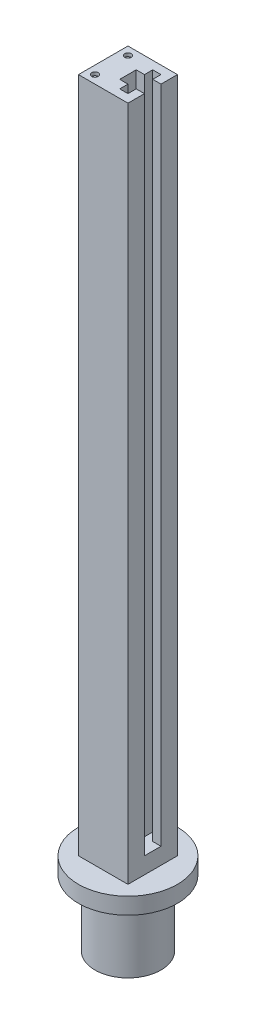
ISO-10303-21;
HEADER;
FILE_DESCRIPTION(('STEP AP214'),'2;1');
FILE_NAME('part.step','',(''),(''),'','','');
FILE_SCHEMA(('AUTOMOTIVE_DESIGN { 1 0 10303 214 1 1 1 1 }'));
ENDSEC;
DATA;
#1=APPLICATION_CONTEXT('core data for automotive mechanical design processes');
#2=APPLICATION_PROTOCOL_DEFINITION('international standard','automotive_design',2000,#1);
#3=PRODUCT_CONTEXT('',#1,'mechanical');
#4=PRODUCT('Part','Part','',(#3));
#5=PRODUCT_RELATED_PRODUCT_CATEGORY('part','',(#4));
#6=PRODUCT_DEFINITION_FORMATION('','',#4);
#7=PRODUCT_DEFINITION_CONTEXT('part definition',#1,'design');
#8=PRODUCT_DEFINITION('design','',#6,#7);
#9=PRODUCT_DEFINITION_SHAPE('','',#8);
#10=(LENGTH_UNIT() NAMED_UNIT(*) SI_UNIT(.MILLI.,.METRE.));
#11=(NAMED_UNIT(*) PLANE_ANGLE_UNIT() SI_UNIT($,.RADIAN.));
#12=(NAMED_UNIT(*) SI_UNIT($,.STERADIAN.) SOLID_ANGLE_UNIT());
#13=UNCERTAINTY_MEASURE_WITH_UNIT(LENGTH_MEASURE(1.E-05),#10,'distance_accuracy_value','');
#14=(GEOMETRIC_REPRESENTATION_CONTEXT(3) GLOBAL_UNCERTAINTY_ASSIGNED_CONTEXT((#13)) GLOBAL_UNIT_ASSIGNED_CONTEXT((#10,
#11,#12)) REPRESENTATION_CONTEXT('',''));
#15=CARTESIAN_POINT('',(0.,0.,0.));
#16=DIRECTION('',(0.,0.,1.));
#17=DIRECTION('',(1.,0.,0.));
#18=AXIS2_PLACEMENT_3D('',#15,#16,#17);
#19=CARTESIAN_POINT('',(74.9999999999997,2151.85185185185,-75.));
#20=DIRECTION('',(1.,0.,0.));
#21=DIRECTION('',(0.,0.,-1.));
#22=AXIS2_PLACEMENT_3D('',#19,#20,#21);
#23=PLANE('',#22);
#24=DIRECTION('',(0.,0.,1.));
#25=VECTOR('',#24,1.);
#26=CARTESIAN_POINT('',(74.9999999999997,2151.85185185185,-75.));
#27=LINE('',#26,#25);
#28=CARTESIAN_POINT('',(74.9999999999997,2151.85185185185,-75.));
#29=VERTEX_POINT('',#28);
#30=CARTESIAN_POINT('',(74.9999999999996,2151.85185185185,-25.));
#31=VERTEX_POINT('',#30);
#32=EDGE_CURVE('E187',#29,#31,#27,.T.);
#33=ORIENTED_EDGE('',*,*,#32,.T.);
#34=DIRECTION('',(0.,1.,0.));
#35=VECTOR('',#34,1.);
#36=CARTESIAN_POINT('',(75.,151.851851851852,-25.));
#37=LINE('',#36,#35);
#38=CARTESIAN_POINT('',(75.,151.851851851852,-25.));
#39=VERTEX_POINT('',#38);
#40=EDGE_CURVE('E545',#39,#31,#37,.T.);
#41=ORIENTED_EDGE('',*,*,#40,.F.);
#42=DIRECTION('',(0.,0.,1.));
#43=VECTOR('',#42,1.);
#44=CARTESIAN_POINT('',(75.,151.851851851852,-25.));
#45=LINE('',#44,#43);
#46=CARTESIAN_POINT('',(75.,151.851851851852,25.));
#47=VERTEX_POINT('',#46);
#48=EDGE_CURVE('E497',#39,#47,#45,.T.);
#49=ORIENTED_EDGE('',*,*,#48,.T.);
#50=DIRECTION('',(0.,1.,0.));
#51=VECTOR('',#50,1.);
#52=CARTESIAN_POINT('',(75.,151.851851851852,25.));
#53=LINE('',#52,#51);
#54=CARTESIAN_POINT('',(74.9999999999996,2151.85185185185,25.));
#55=VERTEX_POINT('',#54);
#56=EDGE_CURVE('E542',#47,#55,#53,.T.);
#57=ORIENTED_EDGE('',*,*,#56,.T.);
#58=CARTESIAN_POINT('',(74.9999999999998,2151.85185185185,75.));
#59=VERTEX_POINT('',#58);
#60=EDGE_CURVE('E185',#55,#59,#27,.T.);
#61=ORIENTED_EDGE('',*,*,#60,.T.);
#62=DIRECTION('',(0.,-1.,0.));
#63=VECTOR('',#62,1.);
#64=CARTESIAN_POINT('',(74.9999999999998,2151.85185185185,75.));
#65=LINE('',#64,#63);
#66=CARTESIAN_POINT('',(75.,101.851851851852,75.));
#67=VERTEX_POINT('',#66);
#68=EDGE_CURVE('E207',#59,#67,#65,.T.);
#69=ORIENTED_EDGE('',*,*,#68,.T.);
#70=DIRECTION('',(0.,0.,1.));
#71=VECTOR('',#70,1.);
#72=CARTESIAN_POINT('',(75.,101.851851851852,-75.));
#73=LINE('',#72,#71);
#74=CARTESIAN_POINT('',(75.,101.851851851852,-75.));
#75=VERTEX_POINT('',#74);
#76=EDGE_CURVE('E176',#75,#67,#73,.T.);
#77=ORIENTED_EDGE('',*,*,#76,.F.);
#78=DIRECTION('',(0.,-1.,0.));
#79=VECTOR('',#78,1.);
#80=CARTESIAN_POINT('',(74.9999999999997,2151.85185185185,-75.));
#81=LINE('',#80,#79);
#82=EDGE_CURVE('E205',#29,#75,#81,.T.);
#83=ORIENTED_EDGE('',*,*,#82,.F.);
#84=EDGE_LOOP('',(#33,#41,#49,#57,#61,#69,#77,#83));
#85=FACE_BOUND('',#84,.T.);
#86=ADVANCED_FACE('F38',(#85),#23,.T.);
#87=CARTESIAN_POINT('',(-2.69898972329647E-13,2151.85185185185,0.));
#88=DIRECTION('',(0.,-1.,0.));
#89=DIRECTION('',(1.,0.,0.));
#90=AXIS2_PLACEMENT_3D('',#87,#88,#89);
#91=PLANE('',#90);
#92=CARTESIAN_POINT('',(-50.0000000000004,2151.85185185185,-50.));
#93=DIRECTION('',(0.,1.,0.));
#94=DIRECTION('',(-1.,0.,0.));
#95=AXIS2_PLACEMENT_3D('',#92,#93,#94);
#96=CIRCLE('',#95,10.);
#97=CARTESIAN_POINT('',(-60.0000000000004,2151.85185185185,-50.));
#98=VERTEX_POINT('',#97);
#99=EDGE_CURVE('E476',#98,#98,#96,.T.);
#100=ORIENTED_EDGE('',*,*,#99,.F.);
#101=EDGE_LOOP('',(#100));
#102=FACE_BOUND('',#101,.T.);
#103=CARTESIAN_POINT('',(-50.0000000000005,2151.85185185185,50.));
#104=DIRECTION('',(0.,1.,0.));
#105=DIRECTION('',(1.,0.,0.));
#106=AXIS2_PLACEMENT_3D('',#103,#104,#105);
#107=CIRCLE('',#106,10.);
#108=CARTESIAN_POINT('',(-40.0000000000005,2151.85185185185,50.));
#109=VERTEX_POINT('',#108);
#110=EDGE_CURVE('E485',#109,#109,#107,.T.);
#111=ORIENTED_EDGE('',*,*,#110,.F.);
#112=EDGE_LOOP('',(#111));
#113=FACE_BOUND('',#112,.T.);
#114=DIRECTION('',(1.,0.,0.));
#115=VECTOR('',#114,1.);
#116=CARTESIAN_POINT('',(49.9999999999996,2151.85185185185,-25.));
#117=LINE('',#116,#115);
#118=CARTESIAN_POINT('',(49.9999999999996,2151.85185185185,-25.));
#119=VERTEX_POINT('',#118);
#120=EDGE_CURVE('E521',#119,#31,#117,.T.);
#121=ORIENTED_EDGE('',*,*,#120,.T.);
#122=ORIENTED_EDGE('',*,*,#32,.F.);
#123=DIRECTION('',(1.,0.,0.));
#124=VECTOR('',#123,1.);
#125=CARTESIAN_POINT('',(-75.0000000000003,2151.85185185185,-75.));
#126=LINE('',#125,#124);
#127=CARTESIAN_POINT('',(-75.0000000000003,2151.85185185185,-75.));
#128=VERTEX_POINT('',#127);
#129=EDGE_CURVE('E190',#128,#29,#126,.T.);
#130=ORIENTED_EDGE('',*,*,#129,.F.);
#131=DIRECTION('',(0.,0.,1.));
#132=VECTOR('',#131,1.);
#133=CARTESIAN_POINT('',(-75.0000000000003,2151.85185185185,-75.));
#134=LINE('',#133,#132);
#135=CARTESIAN_POINT('',(-75.0000000000002,2151.85185185185,75.));
#136=VERTEX_POINT('',#135);
#137=EDGE_CURVE('E193',#128,#136,#134,.T.);
#138=ORIENTED_EDGE('',*,*,#137,.T.);
#139=DIRECTION('',(1.,0.,0.));
#140=VECTOR('',#139,1.);
#141=CARTESIAN_POINT('',(-75.0000000000002,2151.85185185185,75.));
#142=LINE('',#141,#140);
#143=EDGE_CURVE('E182',#136,#59,#142,.T.);
#144=ORIENTED_EDGE('',*,*,#143,.T.);
#145=ORIENTED_EDGE('',*,*,#60,.F.);
#146=DIRECTION('',(-1.,0.,0.));
#147=VECTOR('',#146,1.);
#148=CARTESIAN_POINT('',(74.9999999999996,2151.85185185185,25.));
#149=LINE('',#148,#147);
#150=CARTESIAN_POINT('',(49.9999999999996,2151.85185185185,25.));
#151=VERTEX_POINT('',#150);
#152=EDGE_CURVE('E524',#55,#151,#149,.T.);
#153=ORIENTED_EDGE('',*,*,#152,.T.);
#154=DIRECTION('',(0.,0.,1.));
#155=VECTOR('',#154,1.);
#156=CARTESIAN_POINT('',(49.9999999999996,2151.85185185185,25.));
#157=LINE('',#156,#155);
#158=CARTESIAN_POINT('',(49.9999999999996,2151.85185185185,50.));
#159=VERTEX_POINT('',#158);
#160=EDGE_CURVE('E527',#151,#159,#157,.T.);
#161=ORIENTED_EDGE('',*,*,#160,.T.);
#162=DIRECTION('',(-1.,0.,0.));
#163=VECTOR('',#162,1.);
#164=CARTESIAN_POINT('',(49.9999999999996,2151.85185185185,50.));
#165=LINE('',#164,#163);
#166=CARTESIAN_POINT('',(24.9999999999996,2151.85185185185,50.));
#167=VERTEX_POINT('',#166);
#168=EDGE_CURVE('E530',#159,#167,#165,.T.);
#169=ORIENTED_EDGE('',*,*,#168,.T.);
#170=DIRECTION('',(0.,0.,-1.));
#171=VECTOR('',#170,1.);
#172=CARTESIAN_POINT('',(24.9999999999996,2151.85185185185,50.));
#173=LINE('',#172,#171);
#174=CARTESIAN_POINT('',(24.9999999999996,2151.85185185185,25.));
#175=VERTEX_POINT('',#174);
#176=EDGE_CURVE('E169',#167,#175,#173,.T.);
#177=ORIENTED_EDGE('',*,*,#176,.T.);
#178=DIRECTION('',(-1.,0.,0.));
#179=VECTOR('',#178,1.);
#180=CARTESIAN_POINT('',(24.9999999999996,2151.85185185185,25.));
#181=LINE('',#180,#179);
#182=CARTESIAN_POINT('',(-3.98172578584701E-13,2151.85185185185,25.));
#183=VERTEX_POINT('',#182);
#184=EDGE_CURVE('E53',#175,#183,#181,.T.);
#185=ORIENTED_EDGE('',*,*,#184,.T.);
#186=DIRECTION('',(0.,0.,-1.));
#187=VECTOR('',#186,1.);
#188=CARTESIAN_POINT('',(-3.98172578584701E-13,2151.85185185185,0.));
#189=LINE('',#188,#187);
#190=CARTESIAN_POINT('',(-3.98172578584701E-13,2151.85185185185,-25.));
#191=VERTEX_POINT('',#190);
#192=EDGE_CURVE('E173',#183,#191,#189,.T.);
#193=ORIENTED_EDGE('',*,*,#192,.T.);
#194=DIRECTION('',(1.,0.,0.));
#195=VECTOR('',#194,1.);
#196=CARTESIAN_POINT('',(-3.98172578584701E-13,2151.85185185185,-25.));
#197=LINE('',#196,#195);
#198=CARTESIAN_POINT('',(24.9999999999996,2151.85185185185,-25.));
#199=VERTEX_POINT('',#198);
#200=EDGE_CURVE('E509',#191,#199,#197,.T.);
#201=ORIENTED_EDGE('',*,*,#200,.T.);
#202=DIRECTION('',(0.,0.,-1.));
#203=VECTOR('',#202,1.);
#204=CARTESIAN_POINT('',(24.9999999999996,2151.85185185185,-25.));
#205=LINE('',#204,#203);
#206=CARTESIAN_POINT('',(24.9999999999996,2151.85185185185,-50.));
#207=VERTEX_POINT('',#206);
#208=EDGE_CURVE('E512',#199,#207,#205,.T.);
#209=ORIENTED_EDGE('',*,*,#208,.T.);
#210=DIRECTION('',(1.,0.,0.));
#211=VECTOR('',#210,1.);
#212=CARTESIAN_POINT('',(24.9999999999996,2151.85185185185,-50.));
#213=LINE('',#212,#211);
#214=CARTESIAN_POINT('',(49.9999999999996,2151.85185185185,-50.));
#215=VERTEX_POINT('',#214);
#216=EDGE_CURVE('E515',#207,#215,#213,.T.);
#217=ORIENTED_EDGE('',*,*,#216,.T.);
#218=DIRECTION('',(0.,0.,1.));
#219=VECTOR('',#218,1.);
#220=CARTESIAN_POINT('',(49.9999999999996,2151.85185185185,-50.));
#221=LINE('',#220,#219);
#222=EDGE_CURVE('E518',#215,#119,#221,.T.);
#223=ORIENTED_EDGE('',*,*,#222,.T.);
#224=EDGE_LOOP('',(#121,#122,#130,#138,#144,#145,#153,#161,#169,#177,#185,#193,#201,#209,#217,#223));
#225=FACE_BOUND('',#224,.T.);
#226=ADVANCED_FACE('F230',(#102,#113,#225),#91,.F.);
#227=CARTESIAN_POINT('',(0.,101.851851851852,0.));
#228=DIRECTION('',(0.,-1.,0.));
#229=DIRECTION('',(1.,0.,0.));
#230=AXIS2_PLACEMENT_3D('',#227,#228,#229);
#231=PLANE('',#230);
#232=CARTESIAN_POINT('',(0.,101.851851851852,0.));
#233=DIRECTION('',(0.,1.,0.));
#234=DIRECTION('',(-1.,0.,0.));
#235=AXIS2_PLACEMENT_3D('',#232,#233,#234);
#236=CIRCLE('',#235,150.);
#237=CARTESIAN_POINT('',(-150.,101.851851851852,0.));
#238=VERTEX_POINT('',#237);
#239=EDGE_CURVE('E209',#238,#238,#236,.T.);
#240=ORIENTED_EDGE('',*,*,#239,.T.);
#241=EDGE_LOOP('',(#240));
#242=FACE_BOUND('',#241,.T.);
#243=DIRECTION('',(1.,0.,0.));
#244=VECTOR('',#243,1.);
#245=CARTESIAN_POINT('',(-75.,101.851851851852,75.));
#246=LINE('',#245,#244);
#247=CARTESIAN_POINT('',(-75.,101.851851851852,75.));
#248=VERTEX_POINT('',#247);
#249=EDGE_CURVE('E61',#248,#67,#246,.T.);
#250=ORIENTED_EDGE('',*,*,#249,.F.);
#251=DIRECTION('',(0.,0.,1.));
#252=VECTOR('',#251,1.);
#253=CARTESIAN_POINT('',(-75.,101.851851851852,-75.));
#254=LINE('',#253,#252);
#255=CARTESIAN_POINT('',(-75.,101.851851851852,-75.));
#256=VERTEX_POINT('',#255);
#257=EDGE_CURVE('E186',#256,#248,#254,.T.);
#258=ORIENTED_EDGE('',*,*,#257,.F.);
#259=DIRECTION('',(1.,0.,0.));
#260=VECTOR('',#259,1.);
#261=CARTESIAN_POINT('',(-75.,101.851851851852,-75.));
#262=LINE('',#261,#260);
#263=EDGE_CURVE('E198',#256,#75,#262,.T.);
#264=ORIENTED_EDGE('',*,*,#263,.T.);
#265=ORIENTED_EDGE('',*,*,#76,.T.);
#266=EDGE_LOOP('',(#250,#258,#264,#265));
#267=FACE_BOUND('',#266,.T.);
#268=ADVANCED_FACE('F40',(#242,#267),#231,.F.);
#269=CARTESIAN_POINT('',(0.,-148.148148148148,0.));
#270=DIRECTION('',(0.,1.,0.));
#271=DIRECTION('',(-1.,0.,0.));
#272=AXIS2_PLACEMENT_3D('',#269,#270,#271);
#273=PLANE('',#272);
#274=CARTESIAN_POINT('',(0.,-148.148148148148,0.));
#275=DIRECTION('',(0.,1.,0.));
#276=DIRECTION('',(-1.,0.,0.));
#277=AXIS2_PLACEMENT_3D('',#274,#275,#276);
#278=CIRCLE('',#277,100.);
#279=CARTESIAN_POINT('',(-100.,-148.148148148148,0.));
#280=VERTEX_POINT('',#279);
#281=EDGE_CURVE('E11',#280,#280,#278,.T.);
#282=ORIENTED_EDGE('',*,*,#281,.F.);
#283=EDGE_LOOP('',(#282));
#284=FACE_BOUND('',#283,.T.);
#285=ADVANCED_FACE('F222',(#284),#273,.F.);
#286=CARTESIAN_POINT('',(0.,101.851851851852,0.));
#287=DIRECTION('',(0.,1.,0.));
#288=DIRECTION('',(-1.,0.,0.));
#289=AXIS2_PLACEMENT_3D('',#286,#287,#288);
#290=CYLINDRICAL_SURFACE('',#289,100.);
#291=CARTESIAN_POINT('',(0.,51.8518518518519,0.));
#292=DIRECTION('',(0.,1.,0.));
#293=DIRECTION('',(-1.,0.,0.));
#294=AXIS2_PLACEMENT_3D('',#291,#292,#293);
#295=CIRCLE('',#294,100.);
#296=CARTESIAN_POINT('',(-100.,51.8518518518519,0.));
#297=VERTEX_POINT('',#296);
#298=EDGE_CURVE('E46',#297,#297,#295,.T.);
#299=ORIENTED_EDGE('',*,*,#298,.F.);
#300=EDGE_LOOP('',(#299));
#301=FACE_BOUND('',#300,.T.);
#302=ORIENTED_EDGE('',*,*,#281,.T.);
#303=EDGE_LOOP('',(#302));
#304=FACE_BOUND('',#303,.T.);
#305=ADVANCED_FACE('F219',(#301,#304),#290,.T.);
#306=CARTESIAN_POINT('',(0.,51.8518518518519,0.));
#307=DIRECTION('',(0.,1.,0.));
#308=DIRECTION('',(-1.,0.,0.));
#309=AXIS2_PLACEMENT_3D('',#306,#307,#308);
#310=PLANE('',#309);
#311=CARTESIAN_POINT('',(0.,51.8518518518519,0.));
#312=DIRECTION('',(0.,1.,0.));
#313=DIRECTION('',(-1.,0.,0.));
#314=AXIS2_PLACEMENT_3D('',#311,#312,#313);
#315=CIRCLE('',#314,150.);
#316=CARTESIAN_POINT('',(-150.,51.8518518518519,0.));
#317=VERTEX_POINT('',#316);
#318=EDGE_CURVE('E212',#317,#317,#315,.T.);
#319=ORIENTED_EDGE('',*,*,#318,.F.);
#320=EDGE_LOOP('',(#319));
#321=FACE_BOUND('',#320,.T.);
#322=ORIENTED_EDGE('',*,*,#298,.T.);
#323=EDGE_LOOP('',(#322));
#324=FACE_BOUND('',#323,.T.);
#325=ADVANCED_FACE('F217',(#321,#324),#310,.F.);
#326=CARTESIAN_POINT('',(0.,101.851851851852,0.));
#327=DIRECTION('',(0.,1.,0.));
#328=DIRECTION('',(-1.,0.,0.));
#329=AXIS2_PLACEMENT_3D('',#326,#327,#328);
#330=CYLINDRICAL_SURFACE('',#329,150.);
#331=ORIENTED_EDGE('',*,*,#239,.F.);
#332=EDGE_LOOP('',(#331));
#333=FACE_BOUND('',#332,.T.);
#334=ORIENTED_EDGE('',*,*,#318,.T.);
#335=EDGE_LOOP('',(#334));
#336=FACE_BOUND('',#335,.T.);
#337=ADVANCED_FACE('F247',(#333,#336),#330,.T.);
#338=CARTESIAN_POINT('',(-75.0000000000002,2151.85185185185,75.));
#339=DIRECTION('',(0.,0.,-1.));
#340=DIRECTION('',(-1.,0.,0.));
#341=AXIS2_PLACEMENT_3D('',#338,#339,#340);
#342=PLANE('',#341);
#343=ORIENTED_EDGE('',*,*,#249,.T.);
#344=ORIENTED_EDGE('',*,*,#68,.F.);
#345=ORIENTED_EDGE('',*,*,#143,.F.);
#346=DIRECTION('',(0.,-1.,0.));
#347=VECTOR('',#346,1.);
#348=CARTESIAN_POINT('',(-75.0000000000002,2151.85185185185,75.));
#349=LINE('',#348,#347);
#350=EDGE_CURVE('E194',#136,#248,#349,.T.);
#351=ORIENTED_EDGE('',*,*,#350,.T.);
#352=EDGE_LOOP('',(#343,#344,#345,#351));
#353=FACE_BOUND('',#352,.T.);
#354=ADVANCED_FACE('F244',(#353),#342,.F.);
#355=CARTESIAN_POINT('',(-75.0000000000003,2151.85185185185,-75.));
#356=DIRECTION('',(0.,0.,-1.));
#357=DIRECTION('',(-1.,0.,0.));
#358=AXIS2_PLACEMENT_3D('',#355,#356,#357);
#359=PLANE('',#358);
#360=ORIENTED_EDGE('',*,*,#263,.F.);
#361=DIRECTION('',(0.,-1.,0.));
#362=VECTOR('',#361,1.);
#363=CARTESIAN_POINT('',(-75.0000000000003,2151.85185185185,-75.));
#364=LINE('',#363,#362);
#365=EDGE_CURVE('E203',#128,#256,#364,.T.);
#366=ORIENTED_EDGE('',*,*,#365,.F.);
#367=ORIENTED_EDGE('',*,*,#129,.T.);
#368=ORIENTED_EDGE('',*,*,#82,.T.);
#369=EDGE_LOOP('',(#360,#366,#367,#368));
#370=FACE_BOUND('',#369,.T.);
#371=ADVANCED_FACE('F242',(#370),#359,.T.);
#372=CARTESIAN_POINT('',(-75.0000000000003,2151.85185185185,-75.));
#373=DIRECTION('',(1.,0.,0.));
#374=DIRECTION('',(0.,1.,0.));
#375=AXIS2_PLACEMENT_3D('',#372,#373,#374);
#376=PLANE('',#375);
#377=ORIENTED_EDGE('',*,*,#257,.T.);
#378=ORIENTED_EDGE('',*,*,#350,.F.);
#379=ORIENTED_EDGE('',*,*,#137,.F.);
#380=ORIENTED_EDGE('',*,*,#365,.T.);
#381=EDGE_LOOP('',(#377,#378,#379,#380));
#382=FACE_BOUND('',#381,.T.);
#383=ADVANCED_FACE('F274',(#382),#376,.F.);
#384=CARTESIAN_POINT('',(25.,151.851851851852,25.));
#385=DIRECTION('',(0.,0.,-1.));
#386=DIRECTION('',(-1.,0.,0.));
#387=AXIS2_PLACEMENT_3D('',#384,#385,#386);
#388=PLANE('',#387);
#389=ORIENTED_EDGE('',*,*,#184,.F.);
#390=DIRECTION('',(0.,1.,0.));
#391=VECTOR('',#390,1.);
#392=CARTESIAN_POINT('',(25.,151.851851851852,25.));
#393=LINE('',#392,#391);
#394=CARTESIAN_POINT('',(25.,151.851851851852,25.));
#395=VERTEX_POINT('',#394);
#396=EDGE_CURVE('E168',#395,#175,#393,.T.);
#397=ORIENTED_EDGE('',*,*,#396,.F.);
#398=DIRECTION('',(-1.,0.,0.));
#399=VECTOR('',#398,1.);
#400=CARTESIAN_POINT('',(25.,151.851851851852,25.));
#401=LINE('',#400,#399);
#402=CARTESIAN_POINT('',(0.,151.851851851852,25.));
#403=VERTEX_POINT('',#402);
#404=EDGE_CURVE('E159',#395,#403,#401,.T.);
#405=ORIENTED_EDGE('',*,*,#404,.T.);
#406=DIRECTION('',(0.,1.,0.));
#407=VECTOR('',#406,1.);
#408=CARTESIAN_POINT('',(0.,151.851851851852,25.));
#409=LINE('',#408,#407);
#410=EDGE_CURVE('E167',#403,#183,#409,.T.);
#411=ORIENTED_EDGE('',*,*,#410,.T.);
#412=EDGE_LOOP('',(#389,#397,#405,#411));
#413=FACE_BOUND('',#412,.T.);
#414=ADVANCED_FACE('F166',(#413),#388,.T.);
#415=CARTESIAN_POINT('',(0.,151.851851851852,0.));
#416=DIRECTION('',(1.,0.,0.));
#417=DIRECTION('',(0.,1.,0.));
#418=AXIS2_PLACEMENT_3D('',#415,#416,#417);
#419=PLANE('',#418);
#420=ORIENTED_EDGE('',*,*,#192,.F.);
#421=ORIENTED_EDGE('',*,*,#410,.F.);
#422=DIRECTION('',(0.,0.,-1.));
#423=VECTOR('',#422,1.);
#424=CARTESIAN_POINT('',(0.,151.851851851852,25.));
#425=LINE('',#424,#423);
#426=CARTESIAN_POINT('',(0.,151.851851851852,-25.));
#427=VERTEX_POINT('',#426);
#428=EDGE_CURVE('E155',#403,#427,#425,.T.);
#429=ORIENTED_EDGE('',*,*,#428,.T.);
#430=DIRECTION('',(0.,1.,0.));
#431=VECTOR('',#430,1.);
#432=CARTESIAN_POINT('',(0.,151.851851851852,-25.));
#433=LINE('',#432,#431);
#434=EDGE_CURVE('E174',#427,#191,#433,.T.);
#435=ORIENTED_EDGE('',*,*,#434,.T.);
#436=EDGE_LOOP('',(#420,#421,#429,#435));
#437=FACE_BOUND('',#436,.T.);
#438=ADVANCED_FACE('F171',(#437),#419,.T.);
#439=CARTESIAN_POINT('',(0.,151.851851851852,-25.));
#440=DIRECTION('',(0.,0.,1.));
#441=DIRECTION('',(0.,-1.,0.));
#442=AXIS2_PLACEMENT_3D('',#439,#440,#441);
#443=PLANE('',#442);
#444=ORIENTED_EDGE('',*,*,#200,.F.);
#445=ORIENTED_EDGE('',*,*,#434,.F.);
#446=DIRECTION('',(1.,0.,0.));
#447=VECTOR('',#446,1.);
#448=CARTESIAN_POINT('',(0.,151.851851851852,-25.));
#449=LINE('',#448,#447);
#450=CARTESIAN_POINT('',(25.,151.851851851852,-25.));
#451=VERTEX_POINT('',#450);
#452=EDGE_CURVE('E161',#427,#451,#449,.T.);
#453=ORIENTED_EDGE('',*,*,#452,.T.);
#454=DIRECTION('',(0.,1.,0.));
#455=VECTOR('',#454,1.);
#456=CARTESIAN_POINT('',(25.,151.851851851852,-25.));
#457=LINE('',#456,#455);
#458=EDGE_CURVE('E178',#451,#199,#457,.T.);
#459=ORIENTED_EDGE('',*,*,#458,.T.);
#460=EDGE_LOOP('',(#444,#445,#453,#459));
#461=FACE_BOUND('',#460,.T.);
#462=ADVANCED_FACE('F293',(#461),#443,.T.);
#463=CARTESIAN_POINT('',(25.,151.851851851852,-25.));
#464=DIRECTION('',(1.,0.,0.));
#465=DIRECTION('',(0.,1.,0.));
#466=AXIS2_PLACEMENT_3D('',#463,#464,#465);
#467=PLANE('',#466);
#468=ORIENTED_EDGE('',*,*,#208,.F.);
#469=ORIENTED_EDGE('',*,*,#458,.F.);
#470=DIRECTION('',(0.,0.,-1.));
#471=VECTOR('',#470,1.);
#472=CARTESIAN_POINT('',(25.,151.851851851852,-25.));
#473=LINE('',#472,#471);
#474=CARTESIAN_POINT('',(25.,151.851851851852,-50.));
#475=VERTEX_POINT('',#474);
#476=EDGE_CURVE('E489',#451,#475,#473,.T.);
#477=ORIENTED_EDGE('',*,*,#476,.T.);
#478=DIRECTION('',(0.,1.,0.));
#479=VECTOR('',#478,1.);
#480=CARTESIAN_POINT('',(25.,151.851851851852,-50.));
#481=LINE('',#480,#479);
#482=EDGE_CURVE('E551',#475,#207,#481,.T.);
#483=ORIENTED_EDGE('',*,*,#482,.T.);
#484=EDGE_LOOP('',(#468,#469,#477,#483));
#485=FACE_BOUND('',#484,.T.);
#486=ADVANCED_FACE('F300',(#485),#467,.T.);
#487=CARTESIAN_POINT('',(25.,151.851851851852,-50.));
#488=DIRECTION('',(0.,0.,1.));
#489=DIRECTION('',(0.,-1.,0.));
#490=AXIS2_PLACEMENT_3D('',#487,#488,#489);
#491=PLANE('',#490);
#492=ORIENTED_EDGE('',*,*,#216,.F.);
#493=ORIENTED_EDGE('',*,*,#482,.F.);
#494=DIRECTION('',(1.,0.,0.));
#495=VECTOR('',#494,1.);
#496=CARTESIAN_POINT('',(25.,151.851851851852,-50.));
#497=LINE('',#496,#495);
#498=CARTESIAN_POINT('',(50.,151.851851851852,-50.));
#499=VERTEX_POINT('',#498);
#500=EDGE_CURVE('E491',#475,#499,#497,.T.);
#501=ORIENTED_EDGE('',*,*,#500,.T.);
#502=DIRECTION('',(0.,1.,0.));
#503=VECTOR('',#502,1.);
#504=CARTESIAN_POINT('',(50.,151.851851851852,-50.));
#505=LINE('',#504,#503);
#506=EDGE_CURVE('E549',#499,#215,#505,.T.);
#507=ORIENTED_EDGE('',*,*,#506,.T.);
#508=EDGE_LOOP('',(#492,#493,#501,#507));
#509=FACE_BOUND('',#508,.T.);
#510=ADVANCED_FACE('F308',(#509),#491,.T.);
#511=CARTESIAN_POINT('',(50.,151.851851851852,-50.));
#512=DIRECTION('',(-1.,0.,0.));
#513=DIRECTION('',(0.,-1.,0.));
#514=AXIS2_PLACEMENT_3D('',#511,#512,#513);
#515=PLANE('',#514);
#516=ORIENTED_EDGE('',*,*,#222,.F.);
#517=ORIENTED_EDGE('',*,*,#506,.F.);
#518=DIRECTION('',(0.,0.,1.));
#519=VECTOR('',#518,1.);
#520=CARTESIAN_POINT('',(50.,151.851851851852,-50.));
#521=LINE('',#520,#519);
#522=CARTESIAN_POINT('',(50.,151.851851851852,-25.));
#523=VERTEX_POINT('',#522);
#524=EDGE_CURVE('E493',#499,#523,#521,.T.);
#525=ORIENTED_EDGE('',*,*,#524,.T.);
#526=DIRECTION('',(0.,1.,0.));
#527=VECTOR('',#526,1.);
#528=CARTESIAN_POINT('',(50.,151.851851851852,-25.));
#529=LINE('',#528,#527);
#530=EDGE_CURVE('E547',#523,#119,#529,.T.);
#531=ORIENTED_EDGE('',*,*,#530,.T.);
#532=EDGE_LOOP('',(#516,#517,#525,#531));
#533=FACE_BOUND('',#532,.T.);
#534=ADVANCED_FACE('F316',(#533),#515,.T.);
#535=CARTESIAN_POINT('',(50.,151.851851851852,-25.));
#536=DIRECTION('',(0.,0.,1.));
#537=DIRECTION('',(0.,-1.,0.));
#538=AXIS2_PLACEMENT_3D('',#535,#536,#537);
#539=PLANE('',#538);
#540=ORIENTED_EDGE('',*,*,#120,.F.);
#541=ORIENTED_EDGE('',*,*,#530,.F.);
#542=DIRECTION('',(1.,0.,0.));
#543=VECTOR('',#542,1.);
#544=CARTESIAN_POINT('',(50.,151.851851851852,-25.));
#545=LINE('',#544,#543);
#546=EDGE_CURVE('E495',#523,#39,#545,.T.);
#547=ORIENTED_EDGE('',*,*,#546,.T.);
#548=ORIENTED_EDGE('',*,*,#40,.T.);
#549=EDGE_LOOP('',(#540,#541,#547,#548));
#550=FACE_BOUND('',#549,.T.);
#551=ADVANCED_FACE('F324',(#550),#539,.T.);
#552=CARTESIAN_POINT('',(75.,151.851851851852,25.));
#553=DIRECTION('',(0.,0.,-1.));
#554=DIRECTION('',(-1.,0.,0.));
#555=AXIS2_PLACEMENT_3D('',#552,#553,#554);
#556=PLANE('',#555);
#557=ORIENTED_EDGE('',*,*,#152,.F.);
#558=ORIENTED_EDGE('',*,*,#56,.F.);
#559=DIRECTION('',(-1.,0.,0.));
#560=VECTOR('',#559,1.);
#561=CARTESIAN_POINT('',(75.,151.851851851852,25.));
#562=LINE('',#561,#560);
#563=CARTESIAN_POINT('',(50.,151.851851851852,25.));
#564=VERTEX_POINT('',#563);
#565=EDGE_CURVE('E500',#47,#564,#562,.T.);
#566=ORIENTED_EDGE('',*,*,#565,.T.);
#567=DIRECTION('',(0.,1.,0.));
#568=VECTOR('',#567,1.);
#569=CARTESIAN_POINT('',(50.,151.851851851852,25.));
#570=LINE('',#569,#568);
#571=EDGE_CURVE('E540',#564,#151,#570,.T.);
#572=ORIENTED_EDGE('',*,*,#571,.T.);
#573=EDGE_LOOP('',(#557,#558,#566,#572));
#574=FACE_BOUND('',#573,.T.);
#575=ADVANCED_FACE('F332',(#574),#556,.T.);
#576=CARTESIAN_POINT('',(50.,151.851851851852,25.));
#577=DIRECTION('',(-1.,0.,0.));
#578=DIRECTION('',(0.,-1.,0.));
#579=AXIS2_PLACEMENT_3D('',#576,#577,#578);
#580=PLANE('',#579);
#581=ORIENTED_EDGE('',*,*,#160,.F.);
#582=ORIENTED_EDGE('',*,*,#571,.F.);
#583=DIRECTION('',(0.,0.,1.));
#584=VECTOR('',#583,1.);
#585=CARTESIAN_POINT('',(50.,151.851851851852,25.));
#586=LINE('',#585,#584);
#587=CARTESIAN_POINT('',(50.,151.851851851852,50.));
#588=VERTEX_POINT('',#587);
#589=EDGE_CURVE('E502',#564,#588,#586,.T.);
#590=ORIENTED_EDGE('',*,*,#589,.T.);
#591=DIRECTION('',(0.,1.,0.));
#592=VECTOR('',#591,1.);
#593=CARTESIAN_POINT('',(50.,151.851851851852,50.));
#594=LINE('',#593,#592);
#595=EDGE_CURVE('E538',#588,#159,#594,.T.);
#596=ORIENTED_EDGE('',*,*,#595,.T.);
#597=EDGE_LOOP('',(#581,#582,#590,#596));
#598=FACE_BOUND('',#597,.T.);
#599=ADVANCED_FACE('F340',(#598),#580,.T.);
#600=CARTESIAN_POINT('',(50.,151.851851851852,50.));
#601=DIRECTION('',(0.,0.,-1.));
#602=DIRECTION('',(0.,1.,0.));
#603=AXIS2_PLACEMENT_3D('',#600,#601,#602);
#604=PLANE('',#603);
#605=ORIENTED_EDGE('',*,*,#168,.F.);
#606=ORIENTED_EDGE('',*,*,#595,.F.);
#607=DIRECTION('',(-1.,0.,0.));
#608=VECTOR('',#607,1.);
#609=CARTESIAN_POINT('',(50.,151.851851851852,50.));
#610=LINE('',#609,#608);
#611=CARTESIAN_POINT('',(25.,151.851851851852,50.));
#612=VERTEX_POINT('',#611);
#613=EDGE_CURVE('E504',#588,#612,#610,.T.);
#614=ORIENTED_EDGE('',*,*,#613,.T.);
#615=DIRECTION('',(0.,1.,0.));
#616=VECTOR('',#615,1.);
#617=CARTESIAN_POINT('',(25.,151.851851851852,50.));
#618=LINE('',#617,#616);
#619=EDGE_CURVE('E536',#612,#167,#618,.T.);
#620=ORIENTED_EDGE('',*,*,#619,.T.);
#621=EDGE_LOOP('',(#605,#606,#614,#620));
#622=FACE_BOUND('',#621,.T.);
#623=ADVANCED_FACE('F348',(#622),#604,.T.);
#624=CARTESIAN_POINT('',(25.,151.851851851852,50.));
#625=DIRECTION('',(1.,0.,0.));
#626=DIRECTION('',(0.,1.,0.));
#627=AXIS2_PLACEMENT_3D('',#624,#625,#626);
#628=PLANE('',#627);
#629=ORIENTED_EDGE('',*,*,#176,.F.);
#630=ORIENTED_EDGE('',*,*,#619,.F.);
#631=DIRECTION('',(0.,0.,-1.));
#632=VECTOR('',#631,1.);
#633=CARTESIAN_POINT('',(25.,151.851851851852,50.));
#634=LINE('',#633,#632);
#635=EDGE_CURVE('E506',#612,#395,#634,.T.);
#636=ORIENTED_EDGE('',*,*,#635,.T.);
#637=ORIENTED_EDGE('',*,*,#396,.T.);
#638=EDGE_LOOP('',(#629,#630,#636,#637));
#639=FACE_BOUND('',#638,.T.);
#640=ADVANCED_FACE('F356',(#639),#628,.T.);
#641=CARTESIAN_POINT('',(3.70074341541719E-13,151.851851851852,0.));
#642=DIRECTION('',(0.,-1.,0.));
#643=DIRECTION('',(0.,0.,-1.));
#644=AXIS2_PLACEMENT_3D('',#641,#642,#643);
#645=PLANE('',#644);
#646=ORIENTED_EDGE('',*,*,#404,.F.);
#647=ORIENTED_EDGE('',*,*,#635,.F.);
#648=ORIENTED_EDGE('',*,*,#613,.F.);
#649=ORIENTED_EDGE('',*,*,#589,.F.);
#650=ORIENTED_EDGE('',*,*,#565,.F.);
#651=ORIENTED_EDGE('',*,*,#48,.F.);
#652=ORIENTED_EDGE('',*,*,#546,.F.);
#653=ORIENTED_EDGE('',*,*,#524,.F.);
#654=ORIENTED_EDGE('',*,*,#500,.F.);
#655=ORIENTED_EDGE('',*,*,#476,.F.);
#656=ORIENTED_EDGE('',*,*,#452,.F.);
#657=ORIENTED_EDGE('',*,*,#428,.F.);
#658=EDGE_LOOP('',(#646,#647,#648,#649,#650,#651,#652,#653,#654,#655,#656,#657));
#659=FACE_BOUND('',#658,.T.);
#660=ADVANCED_FACE('F157',(#659),#645,.F.);
#661=CARTESIAN_POINT('',(-50.0000000000005,2141.85185185185,50.));
#662=DIRECTION('',(0.,1.,0.));
#663=DIRECTION('',(-1.,0.,0.));
#664=AXIS2_PLACEMENT_3D('',#661,#662,#663);
#665=CYLINDRICAL_SURFACE('',#664,10.);
#666=CARTESIAN_POINT('',(-50.0000000000005,2141.85185185185,50.));
#667=DIRECTION('',(0.,1.,0.));
#668=DIRECTION('',(1.,0.,0.));
#669=AXIS2_PLACEMENT_3D('',#666,#667,#668);
#670=CIRCLE('',#669,10.);
#671=CARTESIAN_POINT('',(-40.0000000000005,2141.85185185185,50.));
#672=VERTEX_POINT('',#671);
#673=EDGE_CURVE('E480',#672,#672,#670,.T.);
#674=ORIENTED_EDGE('',*,*,#673,.F.);
#675=EDGE_LOOP('',(#674));
#676=FACE_BOUND('',#675,.T.);
#677=ORIENTED_EDGE('',*,*,#110,.T.);
#678=EDGE_LOOP('',(#677));
#679=FACE_BOUND('',#678,.T.);
#680=ADVANCED_FACE('F371',(#676,#679),#665,.F.);
#681=CARTESIAN_POINT('',(-50.0000000000005,2141.85185185185,50.));
#682=DIRECTION('',(0.,-1.,0.));
#683=DIRECTION('',(1.,0.,0.));
#684=AXIS2_PLACEMENT_3D('',#681,#682,#683);
#685=PLANE('',#684);
#686=ORIENTED_EDGE('',*,*,#673,.T.);
#687=EDGE_LOOP('',(#686));
#688=FACE_BOUND('',#687,.T.);
#689=ADVANCED_FACE('F379',(#688),#685,.F.);
#690=CARTESIAN_POINT('',(-50.0000000000004,2141.85185185185,-50.));
#691=DIRECTION('',(0.,1.,0.));
#692=DIRECTION('',(-1.,0.,0.));
#693=AXIS2_PLACEMENT_3D('',#690,#691,#692);
#694=CYLINDRICAL_SURFACE('',#693,10.);
#695=CARTESIAN_POINT('',(-50.0000000000004,2141.85185185185,-50.));
#696=DIRECTION('',(0.,1.,0.));
#697=DIRECTION('',(-1.,0.,0.));
#698=AXIS2_PLACEMENT_3D('',#695,#696,#697);
#699=CIRCLE('',#698,10.);
#700=CARTESIAN_POINT('',(-60.0000000000004,2141.85185185185,-50.));
#701=VERTEX_POINT('',#700);
#702=EDGE_CURVE('E475',#701,#701,#699,.T.);
#703=ORIENTED_EDGE('',*,*,#702,.F.);
#704=EDGE_LOOP('',(#703));
#705=FACE_BOUND('',#704,.T.);
#706=ORIENTED_EDGE('',*,*,#99,.T.);
#707=EDGE_LOOP('',(#706));
#708=FACE_BOUND('',#707,.T.);
#709=ADVANCED_FACE('F387',(#705,#708),#694,.F.);
#710=CARTESIAN_POINT('',(-50.0000000000004,2141.85185185185,-50.));
#711=DIRECTION('',(0.,1.,0.));
#712=DIRECTION('',(-1.,0.,0.));
#713=AXIS2_PLACEMENT_3D('',#710,#711,#712);
#714=PLANE('',#713);
#715=ORIENTED_EDGE('',*,*,#702,.T.);
#716=EDGE_LOOP('',(#715));
#717=FACE_BOUND('',#716,.T.);
#718=ADVANCED_FACE('F395',(#717),#714,.T.);
#719=CLOSED_SHELL('',(#86,#226,#268,#285,#305,#325,#337,#354,#371,#383,#414,#438,#462,#486,#510,
#534,#551,#575,#599,#623,#640,#660,#680,#689,#709,#718));
#720=MANIFOLD_SOLID_BREP('B2',#719);
#721=ADVANCED_BREP_SHAPE_REPRESENTATION('',(#18,#720),#14);
#722=SHAPE_DEFINITION_REPRESENTATION(#9,#721);
ENDSEC;
END-ISO-10303-21;
